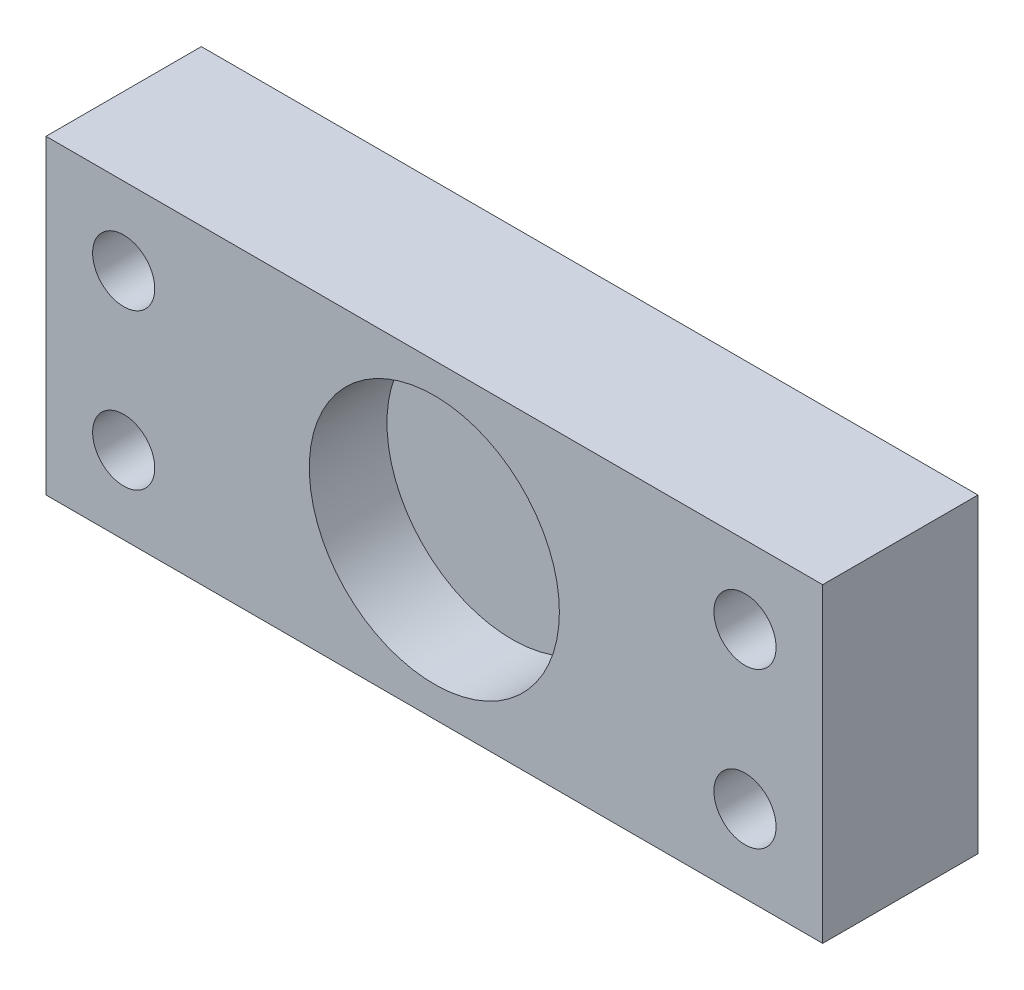
ISO-10303-21;
HEADER;
FILE_DESCRIPTION(('STEP AP214'),'2;1');
FILE_NAME('part.step','',(''),(''),'','','');
FILE_SCHEMA(('AUTOMOTIVE_DESIGN { 1 0 10303 214 1 1 1 1 }'));
ENDSEC;
DATA;
#1=APPLICATION_CONTEXT('core data for automotive mechanical design processes');
#2=APPLICATION_PROTOCOL_DEFINITION('international standard','automotive_design',2000,#1);
#3=PRODUCT_CONTEXT('',#1,'mechanical');
#4=PRODUCT('Part','Part','',(#3));
#5=PRODUCT_RELATED_PRODUCT_CATEGORY('part','',(#4));
#6=PRODUCT_DEFINITION_FORMATION('','',#4);
#7=PRODUCT_DEFINITION_CONTEXT('part definition',#1,'design');
#8=PRODUCT_DEFINITION('design','',#6,#7);
#9=PRODUCT_DEFINITION_SHAPE('','',#8);
#10=(LENGTH_UNIT() NAMED_UNIT(*) SI_UNIT(.MILLI.,.METRE.));
#11=(NAMED_UNIT(*) PLANE_ANGLE_UNIT() SI_UNIT($,.RADIAN.));
#12=(NAMED_UNIT(*) SI_UNIT($,.STERADIAN.) SOLID_ANGLE_UNIT());
#13=UNCERTAINTY_MEASURE_WITH_UNIT(LENGTH_MEASURE(1.E-05),#10,'distance_accuracy_value','');
#14=(GEOMETRIC_REPRESENTATION_CONTEXT(3) GLOBAL_UNCERTAINTY_ASSIGNED_CONTEXT((#13)) GLOBAL_UNIT_ASSIGNED_CONTEXT((#10,
#11,#12)) REPRESENTATION_CONTEXT('',''));
#15=CARTESIAN_POINT('',(0.,0.,0.));
#16=DIRECTION('',(0.,0.,1.));
#17=DIRECTION('',(1.,0.,0.));
#18=AXIS2_PLACEMENT_3D('',#15,#16,#17);
#19=CARTESIAN_POINT('',(-25.,-10.,10.));
#20=DIRECTION('',(1.,0.,0.));
#21=DIRECTION('',(0.,0.,-1.));
#22=AXIS2_PLACEMENT_3D('',#19,#20,#21);
#23=PLANE('',#22);
#24=DIRECTION('',(0.,-1.,0.));
#25=VECTOR('',#24,1.);
#26=CARTESIAN_POINT('',(-25.,-10.,0.));
#27=LINE('',#26,#25);
#28=CARTESIAN_POINT('',(-25.,9.99999999999999,0.));
#29=VERTEX_POINT('',#28);
#30=CARTESIAN_POINT('',(-25.,-10.,0.));
#31=VERTEX_POINT('',#30);
#32=EDGE_CURVE('E95',#29,#31,#27,.T.);
#33=ORIENTED_EDGE('',*,*,#32,.T.);
#34=DIRECTION('',(0.,0.,-1.));
#35=VECTOR('',#34,1.);
#36=CARTESIAN_POINT('',(-25.,-10.,10.));
#37=LINE('',#36,#35);
#38=CARTESIAN_POINT('',(-25.,-10.,10.));
#39=VERTEX_POINT('',#38);
#40=EDGE_CURVE('E11',#39,#31,#37,.T.);
#41=ORIENTED_EDGE('',*,*,#40,.F.);
#42=DIRECTION('',(0.,-1.,0.));
#43=VECTOR('',#42,1.);
#44=CARTESIAN_POINT('',(-25.,-10.,10.));
#45=LINE('',#44,#43);
#46=CARTESIAN_POINT('',(-25.,9.99999999999999,10.));
#47=VERTEX_POINT('',#46);
#48=EDGE_CURVE('E83',#47,#39,#45,.T.);
#49=ORIENTED_EDGE('',*,*,#48,.F.);
#50=DIRECTION('',(0.,0.,-1.));
#51=VECTOR('',#50,1.);
#52=CARTESIAN_POINT('',(-25.,9.99999999999999,10.));
#53=LINE('',#52,#51);
#54=EDGE_CURVE('E91',#47,#29,#53,.T.);
#55=ORIENTED_EDGE('',*,*,#54,.T.);
#56=EDGE_LOOP('',(#33,#41,#49,#55));
#57=FACE_BOUND('',#56,.T.);
#58=ADVANCED_FACE('F32',(#57),#23,.F.);
#59=CARTESIAN_POINT('',(25.,-10.,10.));
#60=DIRECTION('',(0.,1.,0.));
#61=DIRECTION('',(-1.,0.,0.));
#62=AXIS2_PLACEMENT_3D('',#59,#60,#61);
#63=PLANE('',#62);
#64=DIRECTION('',(1.,0.,0.));
#65=VECTOR('',#64,1.);
#66=CARTESIAN_POINT('',(25.,-10.,0.));
#67=LINE('',#66,#65);
#68=CARTESIAN_POINT('',(25.,-10.,0.));
#69=VERTEX_POINT('',#68);
#70=EDGE_CURVE('E87',#31,#69,#67,.T.);
#71=ORIENTED_EDGE('',*,*,#70,.T.);
#72=DIRECTION('',(0.,0.,-1.));
#73=VECTOR('',#72,1.);
#74=CARTESIAN_POINT('',(25.,-10.,10.));
#75=LINE('',#74,#73);
#76=CARTESIAN_POINT('',(25.,-10.,10.));
#77=VERTEX_POINT('',#76);
#78=EDGE_CURVE('E40',#77,#69,#75,.T.);
#79=ORIENTED_EDGE('',*,*,#78,.F.);
#80=DIRECTION('',(1.,0.,0.));
#81=VECTOR('',#80,1.);
#82=CARTESIAN_POINT('',(25.,-10.,10.));
#83=LINE('',#82,#81);
#84=EDGE_CURVE('E78',#39,#77,#83,.T.);
#85=ORIENTED_EDGE('',*,*,#84,.F.);
#86=ORIENTED_EDGE('',*,*,#40,.T.);
#87=EDGE_LOOP('',(#71,#79,#85,#86));
#88=FACE_BOUND('',#87,.T.);
#89=ADVANCED_FACE('F86',(#88),#63,.F.);
#90=CARTESIAN_POINT('',(25.,-10.,10.));
#91=DIRECTION('',(-1.,0.,0.));
#92=DIRECTION('',(0.,0.,1.));
#93=AXIS2_PLACEMENT_3D('',#90,#91,#92);
#94=PLANE('',#93);
#95=DIRECTION('',(0.,1.,0.));
#96=VECTOR('',#95,1.);
#97=CARTESIAN_POINT('',(25.,-10.,0.));
#98=LINE('',#97,#96);
#99=CARTESIAN_POINT('',(25.,10.,0.));
#100=VERTEX_POINT('',#99);
#101=EDGE_CURVE('E65',#69,#100,#98,.T.);
#102=ORIENTED_EDGE('',*,*,#101,.T.);
#103=DIRECTION('',(0.,0.,-1.));
#104=VECTOR('',#103,1.);
#105=CARTESIAN_POINT('',(25.,10.,10.));
#106=LINE('',#105,#104);
#107=CARTESIAN_POINT('',(25.,10.,10.));
#108=VERTEX_POINT('',#107);
#109=EDGE_CURVE('E88',#108,#100,#106,.T.);
#110=ORIENTED_EDGE('',*,*,#109,.F.);
#111=DIRECTION('',(0.,1.,0.));
#112=VECTOR('',#111,1.);
#113=CARTESIAN_POINT('',(25.,-10.,10.));
#114=LINE('',#113,#112);
#115=EDGE_CURVE('E81',#77,#108,#114,.T.);
#116=ORIENTED_EDGE('',*,*,#115,.F.);
#117=ORIENTED_EDGE('',*,*,#78,.T.);
#118=EDGE_LOOP('',(#102,#110,#116,#117));
#119=FACE_BOUND('',#118,.T.);
#120=ADVANCED_FACE('F89',(#119),#94,.F.);
#121=CARTESIAN_POINT('',(25.,10.,10.));
#122=DIRECTION('',(0.,-1.,0.));
#123=DIRECTION('',(1.,0.,0.));
#124=AXIS2_PLACEMENT_3D('',#121,#122,#123);
#125=PLANE('',#124);
#126=DIRECTION('',(-1.,0.,0.));
#127=VECTOR('',#126,1.);
#128=CARTESIAN_POINT('',(25.,10.,0.));
#129=LINE('',#128,#127);
#130=EDGE_CURVE('E71',#100,#29,#129,.T.);
#131=ORIENTED_EDGE('',*,*,#130,.T.);
#132=ORIENTED_EDGE('',*,*,#54,.F.);
#133=DIRECTION('',(-1.,0.,0.));
#134=VECTOR('',#133,1.);
#135=CARTESIAN_POINT('',(25.,10.,10.));
#136=LINE('',#135,#134);
#137=EDGE_CURVE('E48',#108,#47,#136,.T.);
#138=ORIENTED_EDGE('',*,*,#137,.F.);
#139=ORIENTED_EDGE('',*,*,#109,.T.);
#140=EDGE_LOOP('',(#131,#132,#138,#139));
#141=FACE_BOUND('',#140,.T.);
#142=ADVANCED_FACE('F103',(#141),#125,.F.);
#143=CARTESIAN_POINT('',(0.,0.,10.));
#144=DIRECTION('',(0.,0.,1.));
#145=DIRECTION('',(1.,0.,0.));
#146=AXIS2_PLACEMENT_3D('',#143,#144,#145);
#147=PLANE('',#146);
#148=CARTESIAN_POINT('',(20.,-5.,10.));
#149=DIRECTION('',(0.,0.,-1.));
#150=DIRECTION('',(-1.,0.,0.));
#151=AXIS2_PLACEMENT_3D('',#148,#149,#150);
#152=CIRCLE('',#151,2.);
#153=CARTESIAN_POINT('',(18.,-5.,10.));
#154=VERTEX_POINT('',#153);
#155=EDGE_CURVE('E118',#154,#154,#152,.T.);
#156=ORIENTED_EDGE('',*,*,#155,.T.);
#157=EDGE_LOOP('',(#156));
#158=FACE_BOUND('',#157,.T.);
#159=CARTESIAN_POINT('',(-20.,5.,10.));
#160=DIRECTION('',(0.,0.,-1.));
#161=DIRECTION('',(-1.,0.,0.));
#162=AXIS2_PLACEMENT_3D('',#159,#160,#161);
#163=CIRCLE('',#162,2.);
#164=CARTESIAN_POINT('',(-22.,5.,10.));
#165=VERTEX_POINT('',#164);
#166=EDGE_CURVE('E124',#165,#165,#163,.T.);
#167=ORIENTED_EDGE('',*,*,#166,.T.);
#168=EDGE_LOOP('',(#167));
#169=FACE_BOUND('',#168,.T.);
#170=CARTESIAN_POINT('',(-20.,-5.,10.));
#171=DIRECTION('',(0.,0.,-1.));
#172=DIRECTION('',(-1.,0.,0.));
#173=AXIS2_PLACEMENT_3D('',#170,#171,#172);
#174=CIRCLE('',#173,2.);
#175=CARTESIAN_POINT('',(-22.,-5.,10.));
#176=VERTEX_POINT('',#175);
#177=EDGE_CURVE('E125',#176,#176,#174,.T.);
#178=ORIENTED_EDGE('',*,*,#177,.T.);
#179=EDGE_LOOP('',(#178));
#180=FACE_BOUND('',#179,.T.);
#181=CARTESIAN_POINT('',(20.,5.,10.));
#182=DIRECTION('',(0.,0.,-1.));
#183=DIRECTION('',(-1.,0.,0.));
#184=AXIS2_PLACEMENT_3D('',#181,#182,#183);
#185=CIRCLE('',#184,2.);
#186=CARTESIAN_POINT('',(18.,5.,10.));
#187=VERTEX_POINT('',#186);
#188=EDGE_CURVE('E112',#187,#187,#185,.T.);
#189=ORIENTED_EDGE('',*,*,#188,.T.);
#190=EDGE_LOOP('',(#189));
#191=FACE_BOUND('',#190,.T.);
#192=CARTESIAN_POINT('',(0.,0.,10.));
#193=DIRECTION('',(0.,0.,1.));
#194=DIRECTION('',(1.,0.,0.));
#195=AXIS2_PLACEMENT_3D('',#192,#193,#194);
#196=CIRCLE('',#195,8.05);
#197=CARTESIAN_POINT('',(8.05,0.,10.));
#198=VERTEX_POINT('',#197);
#199=EDGE_CURVE('E109',#198,#198,#196,.T.);
#200=ORIENTED_EDGE('',*,*,#199,.F.);
#201=EDGE_LOOP('',(#200));
#202=FACE_BOUND('',#201,.T.);
#203=ORIENTED_EDGE('',*,*,#48,.T.);
#204=ORIENTED_EDGE('',*,*,#84,.T.);
#205=ORIENTED_EDGE('',*,*,#115,.T.);
#206=ORIENTED_EDGE('',*,*,#137,.T.);
#207=EDGE_LOOP('',(#203,#204,#205,#206));
#208=FACE_BOUND('',#207,.T.);
#209=ADVANCED_FACE('F79',(#158,#169,#180,#191,#202,#208),#147,.T.);
#210=CARTESIAN_POINT('',(0.,0.,0.));
#211=DIRECTION('',(0.,0.,1.));
#212=DIRECTION('',(1.,0.,0.));
#213=AXIS2_PLACEMENT_3D('',#210,#211,#212);
#214=PLANE('',#213);
#215=CARTESIAN_POINT('',(20.,-5.,0.));
#216=DIRECTION('',(0.,0.,-1.));
#217=DIRECTION('',(-1.,0.,0.));
#218=AXIS2_PLACEMENT_3D('',#215,#216,#217);
#219=CIRCLE('',#218,2.);
#220=CARTESIAN_POINT('',(18.,-5.,0.));
#221=VERTEX_POINT('',#220);
#222=EDGE_CURVE('E128',#221,#221,#219,.T.);
#223=ORIENTED_EDGE('',*,*,#222,.F.);
#224=EDGE_LOOP('',(#223));
#225=FACE_BOUND('',#224,.T.);
#226=CARTESIAN_POINT('',(-20.,5.,0.));
#227=DIRECTION('',(0.,0.,-1.));
#228=DIRECTION('',(-1.,0.,0.));
#229=AXIS2_PLACEMENT_3D('',#226,#227,#228);
#230=CIRCLE('',#229,2.);
#231=CARTESIAN_POINT('',(-22.,5.,0.));
#232=VERTEX_POINT('',#231);
#233=EDGE_CURVE('E121',#232,#232,#230,.T.);
#234=ORIENTED_EDGE('',*,*,#233,.F.);
#235=EDGE_LOOP('',(#234));
#236=FACE_BOUND('',#235,.T.);
#237=CARTESIAN_POINT('',(-20.,-5.,0.));
#238=DIRECTION('',(0.,0.,-1.));
#239=DIRECTION('',(-1.,0.,0.));
#240=AXIS2_PLACEMENT_3D('',#237,#238,#239);
#241=CIRCLE('',#240,2.);
#242=CARTESIAN_POINT('',(-22.,-5.,0.));
#243=VERTEX_POINT('',#242);
#244=EDGE_CURVE('E133',#243,#243,#241,.T.);
#245=ORIENTED_EDGE('',*,*,#244,.F.);
#246=EDGE_LOOP('',(#245));
#247=FACE_BOUND('',#246,.T.);
#248=CARTESIAN_POINT('',(20.,5.,0.));
#249=DIRECTION('',(0.,0.,-1.));
#250=DIRECTION('',(-1.,0.,0.));
#251=AXIS2_PLACEMENT_3D('',#248,#249,#250);
#252=CIRCLE('',#251,2.);
#253=CARTESIAN_POINT('',(18.,5.,0.));
#254=VERTEX_POINT('',#253);
#255=EDGE_CURVE('E115',#254,#254,#252,.T.);
#256=ORIENTED_EDGE('',*,*,#255,.F.);
#257=EDGE_LOOP('',(#256));
#258=FACE_BOUND('',#257,.T.);
#259=ORIENTED_EDGE('',*,*,#32,.F.);
#260=ORIENTED_EDGE('',*,*,#130,.F.);
#261=ORIENTED_EDGE('',*,*,#101,.F.);
#262=ORIENTED_EDGE('',*,*,#70,.F.);
#263=EDGE_LOOP('',(#259,#260,#261,#262));
#264=FACE_BOUND('',#263,.T.);
#265=ADVANCED_FACE('F106',(#225,#236,#247,#258,#264),#214,.F.);
#266=CARTESIAN_POINT('',(0.,0.,5.));
#267=DIRECTION('',(0.,0.,1.));
#268=DIRECTION('',(1.,0.,0.));
#269=AXIS2_PLACEMENT_3D('',#266,#267,#268);
#270=CYLINDRICAL_SURFACE('',#269,8.05);
#271=CARTESIAN_POINT('',(0.,0.,5.));
#272=DIRECTION('',(0.,0.,1.));
#273=DIRECTION('',(1.,0.,0.));
#274=AXIS2_PLACEMENT_3D('',#271,#272,#273);
#275=CIRCLE('',#274,8.05);
#276=CARTESIAN_POINT('',(8.05,0.,5.));
#277=VERTEX_POINT('',#276);
#278=EDGE_CURVE('E98',#277,#277,#275,.T.);
#279=ORIENTED_EDGE('',*,*,#278,.F.);
#280=EDGE_LOOP('',(#279));
#281=FACE_BOUND('',#280,.T.);
#282=ORIENTED_EDGE('',*,*,#199,.T.);
#283=EDGE_LOOP('',(#282));
#284=FACE_BOUND('',#283,.T.);
#285=ADVANCED_FACE('F151',(#281,#284),#270,.F.);
#286=CARTESIAN_POINT('',(0.,0.,5.));
#287=DIRECTION('',(0.,0.,1.));
#288=DIRECTION('',(1.,0.,0.));
#289=AXIS2_PLACEMENT_3D('',#286,#287,#288);
#290=PLANE('',#289);
#291=ORIENTED_EDGE('',*,*,#278,.T.);
#292=EDGE_LOOP('',(#291));
#293=FACE_BOUND('',#292,.T.);
#294=ADVANCED_FACE('F157',(#293),#290,.T.);
#295=CARTESIAN_POINT('',(20.,5.,10.));
#296=DIRECTION('',(0.,0.,-1.));
#297=DIRECTION('',(-1.,0.,0.));
#298=AXIS2_PLACEMENT_3D('',#295,#296,#297);
#299=CYLINDRICAL_SURFACE('',#298,2.);
#300=ORIENTED_EDGE('',*,*,#188,.F.);
#301=EDGE_LOOP('',(#300));
#302=FACE_BOUND('',#301,.T.);
#303=ORIENTED_EDGE('',*,*,#255,.T.);
#304=EDGE_LOOP('',(#303));
#305=FACE_BOUND('',#304,.T.);
#306=ADVANCED_FACE('F145',(#302,#305),#299,.F.);
#307=CARTESIAN_POINT('',(-20.,-5.,10.));
#308=DIRECTION('',(0.,0.,-1.));
#309=DIRECTION('',(-1.,0.,0.));
#310=AXIS2_PLACEMENT_3D('',#307,#308,#309);
#311=CYLINDRICAL_SURFACE('',#310,2.);
#312=ORIENTED_EDGE('',*,*,#177,.F.);
#313=EDGE_LOOP('',(#312));
#314=FACE_BOUND('',#313,.T.);
#315=ORIENTED_EDGE('',*,*,#244,.T.);
#316=EDGE_LOOP('',(#315));
#317=FACE_BOUND('',#316,.T.);
#318=ADVANCED_FACE('F141',(#314,#317),#311,.F.);
#319=CARTESIAN_POINT('',(-20.,5.,10.));
#320=DIRECTION('',(0.,0.,-1.));
#321=DIRECTION('',(-1.,0.,0.));
#322=AXIS2_PLACEMENT_3D('',#319,#320,#321);
#323=CYLINDRICAL_SURFACE('',#322,2.);
#324=ORIENTED_EDGE('',*,*,#166,.F.);
#325=EDGE_LOOP('',(#324));
#326=FACE_BOUND('',#325,.T.);
#327=ORIENTED_EDGE('',*,*,#233,.T.);
#328=EDGE_LOOP('',(#327));
#329=FACE_BOUND('',#328,.T.);
#330=ADVANCED_FACE('F144',(#326,#329),#323,.F.);
#331=CARTESIAN_POINT('',(20.,-5.,10.));
#332=DIRECTION('',(0.,0.,-1.));
#333=DIRECTION('',(-1.,0.,0.));
#334=AXIS2_PLACEMENT_3D('',#331,#332,#333);
#335=CYLINDRICAL_SURFACE('',#334,2.);
#336=ORIENTED_EDGE('',*,*,#155,.F.);
#337=EDGE_LOOP('',(#336));
#338=FACE_BOUND('',#337,.T.);
#339=ORIENTED_EDGE('',*,*,#222,.T.);
#340=EDGE_LOOP('',(#339));
#341=FACE_BOUND('',#340,.T.);
#342=ADVANCED_FACE('F226',(#338,#341),#335,.F.);
#343=CLOSED_SHELL('',(#58,#89,#120,#142,#209,#265,#285,#294,#306,#318,#330,#342));
#344=MANIFOLD_SOLID_BREP('B2',#343);
#345=ADVANCED_BREP_SHAPE_REPRESENTATION('',(#18,#344),#14);
#346=SHAPE_DEFINITION_REPRESENTATION(#9,#345);
ENDSEC;
END-ISO-10303-21;
